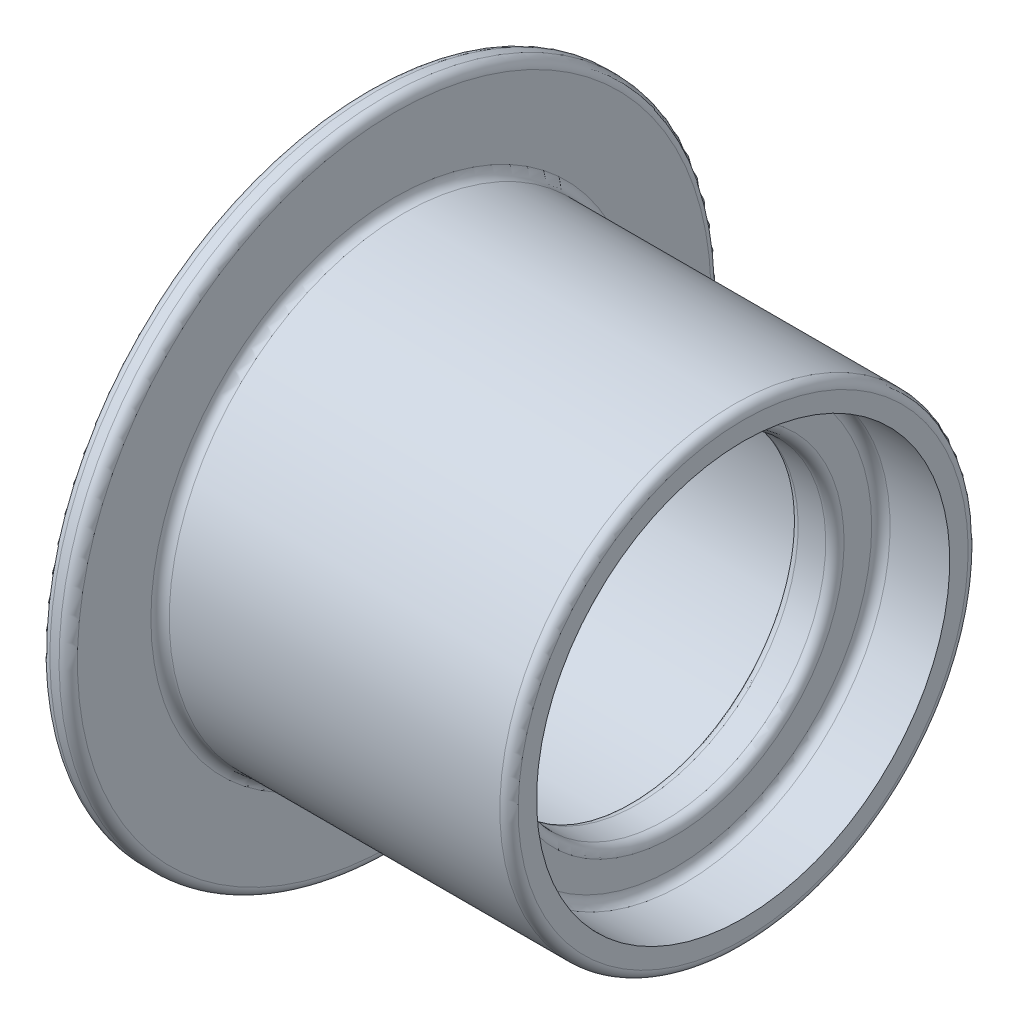
ISO-10303-21;
HEADER;
FILE_DESCRIPTION(('STEP AP214'),'2;1');
FILE_NAME('part.step','',(''),(''),'','','');
FILE_SCHEMA(('AUTOMOTIVE_DESIGN { 1 0 10303 214 1 1 1 1 }'));
ENDSEC;
DATA;
#1=APPLICATION_CONTEXT('core data for automotive mechanical design processes');
#2=APPLICATION_PROTOCOL_DEFINITION('international standard','automotive_design',2000,#1);
#3=PRODUCT_CONTEXT('',#1,'mechanical');
#4=PRODUCT('Part','Part','',(#3));
#5=PRODUCT_RELATED_PRODUCT_CATEGORY('part','',(#4));
#6=PRODUCT_DEFINITION_FORMATION('','',#4);
#7=PRODUCT_DEFINITION_CONTEXT('part definition',#1,'design');
#8=PRODUCT_DEFINITION('design','',#6,#7);
#9=PRODUCT_DEFINITION_SHAPE('','',#8);
#10=(LENGTH_UNIT() NAMED_UNIT(*) SI_UNIT(.MILLI.,.METRE.));
#11=(NAMED_UNIT(*) PLANE_ANGLE_UNIT() SI_UNIT($,.RADIAN.));
#12=(NAMED_UNIT(*) SI_UNIT($,.STERADIAN.) SOLID_ANGLE_UNIT());
#13=UNCERTAINTY_MEASURE_WITH_UNIT(LENGTH_MEASURE(1.E-05),#10,'distance_accuracy_value','');
#14=(GEOMETRIC_REPRESENTATION_CONTEXT(3) GLOBAL_UNCERTAINTY_ASSIGNED_CONTEXT((#13)) GLOBAL_UNIT_ASSIGNED_CONTEXT((#10,
#11,#12)) REPRESENTATION_CONTEXT('',''));
#15=CARTESIAN_POINT('',(0.,0.,0.));
#16=DIRECTION('',(0.,0.,1.));
#17=DIRECTION('',(1.,0.,0.));
#18=AXIS2_PLACEMENT_3D('',#15,#16,#17);
#19=CARTESIAN_POINT('',(-2.,-25.5,0.));
#20=DIRECTION('',(1.,0.,0.));
#21=DIRECTION('',(0.,1.,0.));
#22=AXIS2_PLACEMENT_3D('',#19,#20,#21);
#23=TOROIDAL_SURFACE('',#22,34.5,0.999999999999999);
#24=CARTESIAN_POINT('',(-3.,-25.5,0.));
#25=DIRECTION('',(1.,0.,0.));
#26=DIRECTION('',(0.,1.,0.));
#27=AXIS2_PLACEMENT_3D('',#24,#25,#26);
#28=CIRCLE('',#27,34.5);
#29=CARTESIAN_POINT('',(-3.,8.99999999999999,0.));
#30=VERTEX_POINT('',#29);
#31=EDGE_CURVE('E10',#30,#30,#28,.T.);
#32=ORIENTED_EDGE('',*,*,#31,.T.);
#33=EDGE_LOOP('',(#32));
#34=FACE_BOUND('',#33,.T.);
#35=CARTESIAN_POINT('',(-1.99999999999999,-25.5,0.));
#36=DIRECTION('',(1.,0.,0.));
#37=DIRECTION('',(0.,1.,0.));
#38=AXIS2_PLACEMENT_3D('',#35,#36,#37);
#39=CIRCLE('',#38,35.5);
#40=CARTESIAN_POINT('',(-1.99999999999999,10.,0.));
#41=VERTEX_POINT('',#40);
#42=EDGE_CURVE('E138',#41,#41,#39,.T.);
#43=ORIENTED_EDGE('',*,*,#42,.F.);
#44=EDGE_LOOP('',(#43));
#45=FACE_BOUND('',#44,.T.);
#46=ADVANCED_FACE('F43',(#34,#45),#23,.T.);
#47=CARTESIAN_POINT('',(-3.,8.99999999999999,0.));
#48=DIRECTION('',(-1.,0.,0.));
#49=DIRECTION('',(0.,-1.,0.));
#50=AXIS2_PLACEMENT_3D('',#47,#48,#49);
#51=PLANE('',#50);
#52=CARTESIAN_POINT('',(-3.,-25.5,0.));
#53=DIRECTION('',(1.,0.,0.));
#54=DIRECTION('',(0.,1.,0.));
#55=AXIS2_PLACEMENT_3D('',#52,#53,#54);
#56=CIRCLE('',#55,23.5);
#57=CARTESIAN_POINT('',(-3.,-2.,0.));
#58=VERTEX_POINT('',#57);
#59=EDGE_CURVE('E50',#58,#58,#56,.T.);
#60=ORIENTED_EDGE('',*,*,#59,.T.);
#61=EDGE_LOOP('',(#60));
#62=FACE_BOUND('',#61,.T.);
#63=ORIENTED_EDGE('',*,*,#31,.F.);
#64=EDGE_LOOP('',(#63));
#65=FACE_BOUND('',#64,.T.);
#66=ADVANCED_FACE('F147',(#62,#65),#51,.T.);
#67=CARTESIAN_POINT('',(-2.,-25.5,0.));
#68=DIRECTION('',(1.,0.,0.));
#69=DIRECTION('',(0.,1.,0.));
#70=AXIS2_PLACEMENT_3D('',#67,#68,#69);
#71=TOROIDAL_SURFACE('',#70,23.5,1.);
#72=CARTESIAN_POINT('',(-1.99999999999999,-25.5,0.));
#73=DIRECTION('',(1.,0.,0.));
#74=DIRECTION('',(0.,1.,0.));
#75=AXIS2_PLACEMENT_3D('',#72,#73,#74);
#76=CIRCLE('',#75,22.5);
#77=CARTESIAN_POINT('',(-1.99999999999999,-3.,0.));
#78=VERTEX_POINT('',#77);
#79=EDGE_CURVE('E55',#78,#78,#76,.T.);
#80=ORIENTED_EDGE('',*,*,#79,.T.);
#81=EDGE_LOOP('',(#80));
#82=FACE_BOUND('',#81,.T.);
#83=ORIENTED_EDGE('',*,*,#59,.F.);
#84=EDGE_LOOP('',(#83));
#85=FACE_BOUND('',#84,.T.);
#86=ADVANCED_FACE('F151',(#82,#85),#71,.T.);
#87=CARTESIAN_POINT('',(7.00000000000001,-25.5,0.));
#88=DIRECTION('',(1.,0.,0.));
#89=DIRECTION('',(0.,1.,0.));
#90=AXIS2_PLACEMENT_3D('',#87,#88,#89);
#91=CYLINDRICAL_SURFACE('',#90,22.5);
#92=CARTESIAN_POINT('',(6.,-25.5,0.));
#93=DIRECTION('',(1.,0.,0.));
#94=DIRECTION('',(0.,1.,0.));
#95=AXIS2_PLACEMENT_3D('',#92,#93,#94);
#96=CIRCLE('',#95,22.5);
#97=CARTESIAN_POINT('',(6.,-3.,0.));
#98=VERTEX_POINT('',#97);
#99=EDGE_CURVE('E60',#98,#98,#96,.T.);
#100=ORIENTED_EDGE('',*,*,#99,.T.);
#101=EDGE_LOOP('',(#100));
#102=FACE_BOUND('',#101,.T.);
#103=ORIENTED_EDGE('',*,*,#79,.F.);
#104=EDGE_LOOP('',(#103));
#105=FACE_BOUND('',#104,.T.);
#106=ADVANCED_FACE('F155',(#102,#105),#91,.F.);
#107=CARTESIAN_POINT('',(6.,-25.5,0.));
#108=DIRECTION('',(1.,0.,0.));
#109=DIRECTION('',(0.,1.,0.));
#110=AXIS2_PLACEMENT_3D('',#107,#108,#109);
#111=TOROIDAL_SURFACE('',#110,21.5,1.);
#112=CARTESIAN_POINT('',(7.,-25.5,0.));
#113=DIRECTION('',(1.,0.,0.));
#114=DIRECTION('',(0.,1.,0.));
#115=AXIS2_PLACEMENT_3D('',#112,#113,#114);
#116=CIRCLE('',#115,21.5);
#117=CARTESIAN_POINT('',(7.,-4.,0.));
#118=VERTEX_POINT('',#117);
#119=EDGE_CURVE('E66',#118,#118,#116,.T.);
#120=ORIENTED_EDGE('',*,*,#119,.T.);
#121=EDGE_LOOP('',(#120));
#122=FACE_BOUND('',#121,.T.);
#123=ORIENTED_EDGE('',*,*,#99,.F.);
#124=EDGE_LOOP('',(#123));
#125=FACE_BOUND('',#124,.T.);
#126=ADVANCED_FACE('F162',(#122,#125),#111,.F.);
#127=CARTESIAN_POINT('',(7.,-4.,0.));
#128=DIRECTION('',(-1.,0.,0.));
#129=DIRECTION('',(0.,-1.,0.));
#130=AXIS2_PLACEMENT_3D('',#127,#128,#129);
#131=PLANE('',#130);
#132=CARTESIAN_POINT('',(7.,-25.5,0.));
#133=DIRECTION('',(1.,0.,0.));
#134=DIRECTION('',(0.,1.,0.));
#135=AXIS2_PLACEMENT_3D('',#132,#133,#134);
#136=CIRCLE('',#135,20.9926931818182);
#137=CARTESIAN_POINT('',(7.,-4.50730681818181,0.));
#138=VERTEX_POINT('',#137);
#139=EDGE_CURVE('E70',#138,#138,#136,.T.);
#140=ORIENTED_EDGE('',*,*,#139,.T.);
#141=EDGE_LOOP('',(#140));
#142=FACE_BOUND('',#141,.T.);
#143=ORIENTED_EDGE('',*,*,#119,.F.);
#144=EDGE_LOOP('',(#143));
#145=FACE_BOUND('',#144,.T.);
#146=ADVANCED_FACE('F166',(#142,#145),#131,.T.);
#147=CARTESIAN_POINT('',(8.,-25.5,0.));
#148=DIRECTION('',(1.,0.,0.));
#149=DIRECTION('',(0.,1.,0.));
#150=AXIS2_PLACEMENT_3D('',#147,#148,#149);
#151=TOROIDAL_SURFACE('',#150,20.9926931818182,1.);
#152=CARTESIAN_POINT('',(8.,-25.5,0.));
#153=DIRECTION('',(1.,0.,0.));
#154=DIRECTION('',(0.,1.,0.));
#155=AXIS2_PLACEMENT_3D('',#152,#153,#154);
#156=CIRCLE('',#155,19.9926931818182);
#157=CARTESIAN_POINT('',(8.,-5.50730681818181,0.));
#158=VERTEX_POINT('',#157);
#159=EDGE_CURVE('E74',#158,#158,#156,.T.);
#160=ORIENTED_EDGE('',*,*,#159,.T.);
#161=EDGE_LOOP('',(#160));
#162=FACE_BOUND('',#161,.T.);
#163=ORIENTED_EDGE('',*,*,#139,.F.);
#164=EDGE_LOOP('',(#163));
#165=FACE_BOUND('',#164,.T.);
#166=ADVANCED_FACE('F170',(#162,#165),#151,.T.);
#167=CARTESIAN_POINT('',(7.00000000000001,-25.5,0.));
#168=DIRECTION('',(1.,0.,0.));
#169=DIRECTION('',(0.,1.,0.));
#170=AXIS2_PLACEMENT_3D('',#167,#168,#169);
#171=CYLINDRICAL_SURFACE('',#170,19.9926931818182);
#172=CARTESIAN_POINT('',(24.5,-25.5,0.));
#173=DIRECTION('',(1.,0.,0.));
#174=DIRECTION('',(0.,1.,0.));
#175=AXIS2_PLACEMENT_3D('',#172,#173,#174);
#176=CIRCLE('',#175,19.9926931818182);
#177=CARTESIAN_POINT('',(24.5,-5.5073068181818,0.));
#178=VERTEX_POINT('',#177);
#179=EDGE_CURVE('E78',#178,#178,#176,.T.);
#180=ORIENTED_EDGE('',*,*,#179,.T.);
#181=EDGE_LOOP('',(#180));
#182=FACE_BOUND('',#181,.T.);
#183=ORIENTED_EDGE('',*,*,#159,.F.);
#184=EDGE_LOOP('',(#183));
#185=FACE_BOUND('',#184,.T.);
#186=ADVANCED_FACE('F174',(#182,#185),#171,.F.);
#187=CARTESIAN_POINT('',(24.5,-25.5,0.));
#188=DIRECTION('',(1.,0.,0.));
#189=DIRECTION('',(0.,1.,0.));
#190=AXIS2_PLACEMENT_3D('',#187,#188,#189);
#191=TOROIDAL_SURFACE('',#190,18.9926931818182,1.);
#192=CARTESIAN_POINT('',(25.5,-25.5,0.));
#193=DIRECTION('',(1.,0.,0.));
#194=DIRECTION('',(0.,1.,0.));
#195=AXIS2_PLACEMENT_3D('',#192,#193,#194);
#196=CIRCLE('',#195,18.9926931818182);
#197=CARTESIAN_POINT('',(25.5,-6.5073068181818,0.));
#198=VERTEX_POINT('',#197);
#199=EDGE_CURVE('E82',#198,#198,#196,.T.);
#200=ORIENTED_EDGE('',*,*,#199,.T.);
#201=EDGE_LOOP('',(#200));
#202=FACE_BOUND('',#201,.T.);
#203=ORIENTED_EDGE('',*,*,#179,.F.);
#204=EDGE_LOOP('',(#203));
#205=FACE_BOUND('',#204,.T.);
#206=ADVANCED_FACE('F178',(#202,#205),#191,.F.);
#207=CARTESIAN_POINT('',(25.5,-6.50730681818181,0.));
#208=DIRECTION('',(-1.,0.,0.));
#209=DIRECTION('',(0.,-1.,0.));
#210=AXIS2_PLACEMENT_3D('',#207,#208,#209);
#211=PLANE('',#210);
#212=CARTESIAN_POINT('',(25.5,-25.5,0.));
#213=DIRECTION('',(1.,0.,0.));
#214=DIRECTION('',(0.,1.,0.));
#215=AXIS2_PLACEMENT_3D('',#212,#213,#214);
#216=CIRCLE('',#215,18.4926931818182);
#217=CARTESIAN_POINT('',(25.5,-7.0073068181818,0.));
#218=VERTEX_POINT('',#217);
#219=EDGE_CURVE('E86',#218,#218,#216,.T.);
#220=ORIENTED_EDGE('',*,*,#219,.T.);
#221=EDGE_LOOP('',(#220));
#222=FACE_BOUND('',#221,.T.);
#223=ORIENTED_EDGE('',*,*,#199,.F.);
#224=EDGE_LOOP('',(#223));
#225=FACE_BOUND('',#224,.T.);
#226=ADVANCED_FACE('F182',(#222,#225),#211,.T.);
#227=CARTESIAN_POINT('',(26.5,-25.5,0.));
#228=DIRECTION('',(1.,0.,0.));
#229=DIRECTION('',(0.,1.,0.));
#230=AXIS2_PLACEMENT_3D('',#227,#228,#229);
#231=TOROIDAL_SURFACE('',#230,18.4926931818182,1.);
#232=CARTESIAN_POINT('',(26.5,-25.5,0.));
#233=DIRECTION('',(1.,0.,0.));
#234=DIRECTION('',(0.,1.,0.));
#235=AXIS2_PLACEMENT_3D('',#232,#233,#234);
#236=CIRCLE('',#235,17.4926931818182);
#237=CARTESIAN_POINT('',(26.5,-8.00730681818181,0.));
#238=VERTEX_POINT('',#237);
#239=EDGE_CURVE('E90',#238,#238,#236,.T.);
#240=ORIENTED_EDGE('',*,*,#239,.T.);
#241=EDGE_LOOP('',(#240));
#242=FACE_BOUND('',#241,.T.);
#243=ORIENTED_EDGE('',*,*,#219,.F.);
#244=EDGE_LOOP('',(#243));
#245=FACE_BOUND('',#244,.T.);
#246=ADVANCED_FACE('F186',(#242,#245),#231,.T.);
#247=CARTESIAN_POINT('',(7.00000000000001,-25.5,0.));
#248=DIRECTION('',(1.,0.,0.));
#249=DIRECTION('',(0.,1.,0.));
#250=AXIS2_PLACEMENT_3D('',#247,#248,#249);
#251=CYLINDRICAL_SURFACE('',#250,17.4926931818182);
#252=CARTESIAN_POINT('',(29.5,-25.5,0.));
#253=DIRECTION('',(1.,0.,0.));
#254=DIRECTION('',(0.,1.,0.));
#255=AXIS2_PLACEMENT_3D('',#252,#253,#254);
#256=CIRCLE('',#255,17.4926931818182);
#257=CARTESIAN_POINT('',(29.5,-8.00730681818181,0.));
#258=VERTEX_POINT('',#257);
#259=EDGE_CURVE('E94',#258,#258,#256,.T.);
#260=ORIENTED_EDGE('',*,*,#259,.T.);
#261=EDGE_LOOP('',(#260));
#262=FACE_BOUND('',#261,.T.);
#263=ORIENTED_EDGE('',*,*,#239,.F.);
#264=EDGE_LOOP('',(#263));
#265=FACE_BOUND('',#264,.T.);
#266=ADVANCED_FACE('F190',(#262,#265),#251,.F.);
#267=CARTESIAN_POINT('',(29.5,-25.5,0.));
#268=DIRECTION('',(1.,0.,0.));
#269=DIRECTION('',(0.,1.,0.));
#270=AXIS2_PLACEMENT_3D('',#267,#268,#269);
#271=TOROIDAL_SURFACE('',#270,18.4926931818182,1.);
#272=CARTESIAN_POINT('',(30.5,-25.5,0.));
#273=DIRECTION('',(1.,0.,0.));
#274=DIRECTION('',(0.,1.,0.));
#275=AXIS2_PLACEMENT_3D('',#272,#273,#274);
#276=CIRCLE('',#275,18.4926931818182);
#277=CARTESIAN_POINT('',(30.5,-7.0073068181818,0.));
#278=VERTEX_POINT('',#277);
#279=EDGE_CURVE('E98',#278,#278,#276,.T.);
#280=ORIENTED_EDGE('',*,*,#279,.T.);
#281=EDGE_LOOP('',(#280));
#282=FACE_BOUND('',#281,.T.);
#283=ORIENTED_EDGE('',*,*,#259,.F.);
#284=EDGE_LOOP('',(#283));
#285=FACE_BOUND('',#284,.T.);
#286=ADVANCED_FACE('F194',(#282,#285),#271,.T.);
#287=CARTESIAN_POINT('',(30.5,-7.00730681818181,0.));
#288=DIRECTION('',(1.,0.,0.));
#289=DIRECTION('',(0.,1.,0.));
#290=AXIS2_PLACEMENT_3D('',#287,#288,#289);
#291=PLANE('',#290);
#292=CARTESIAN_POINT('',(30.5,-25.5,0.));
#293=DIRECTION('',(1.,0.,0.));
#294=DIRECTION('',(0.,1.,0.));
#295=AXIS2_PLACEMENT_3D('',#292,#293,#294);
#296=CIRCLE('',#295,21.5);
#297=CARTESIAN_POINT('',(30.5,-4.,0.));
#298=VERTEX_POINT('',#297);
#299=EDGE_CURVE('E102',#298,#298,#296,.T.);
#300=ORIENTED_EDGE('',*,*,#299,.T.);
#301=EDGE_LOOP('',(#300));
#302=FACE_BOUND('',#301,.T.);
#303=ORIENTED_EDGE('',*,*,#279,.F.);
#304=EDGE_LOOP('',(#303));
#305=FACE_BOUND('',#304,.T.);
#306=ADVANCED_FACE('F198',(#302,#305),#291,.T.);
#307=CARTESIAN_POINT('',(31.5,-25.5,0.));
#308=DIRECTION('',(1.,0.,0.));
#309=DIRECTION('',(0.,1.,0.));
#310=AXIS2_PLACEMENT_3D('',#307,#308,#309);
#311=TOROIDAL_SURFACE('',#310,21.5,1.);
#312=CARTESIAN_POINT('',(31.5,-25.5,0.));
#313=DIRECTION('',(1.,0.,0.));
#314=DIRECTION('',(0.,1.,0.));
#315=AXIS2_PLACEMENT_3D('',#312,#313,#314);
#316=CIRCLE('',#315,22.5);
#317=CARTESIAN_POINT('',(31.5,-3.,0.));
#318=VERTEX_POINT('',#317);
#319=EDGE_CURVE('E106',#318,#318,#316,.T.);
#320=ORIENTED_EDGE('',*,*,#319,.T.);
#321=EDGE_LOOP('',(#320));
#322=FACE_BOUND('',#321,.T.);
#323=ORIENTED_EDGE('',*,*,#299,.F.);
#324=EDGE_LOOP('',(#323));
#325=FACE_BOUND('',#324,.T.);
#326=ADVANCED_FACE('F202',(#322,#325),#311,.F.);
#327=CARTESIAN_POINT('',(7.00000000000001,-25.5,0.));
#328=DIRECTION('',(1.,0.,0.));
#329=DIRECTION('',(0.,1.,0.));
#330=AXIS2_PLACEMENT_3D('',#327,#328,#329);
#331=CYLINDRICAL_SURFACE('',#330,22.5);
#332=CARTESIAN_POINT('',(38.,-25.5,0.));
#333=DIRECTION('',(1.,0.,0.));
#334=DIRECTION('',(0.,1.,0.));
#335=AXIS2_PLACEMENT_3D('',#332,#333,#334);
#336=CIRCLE('',#335,22.5);
#337=CARTESIAN_POINT('',(38.,-3.,0.));
#338=VERTEX_POINT('',#337);
#339=EDGE_CURVE('E110',#338,#338,#336,.T.);
#340=ORIENTED_EDGE('',*,*,#339,.T.);
#341=EDGE_LOOP('',(#340));
#342=FACE_BOUND('',#341,.T.);
#343=ORIENTED_EDGE('',*,*,#319,.F.);
#344=EDGE_LOOP('',(#343));
#345=FACE_BOUND('',#344,.T.);
#346=ADVANCED_FACE('F206',(#342,#345),#331,.F.);
#347=CARTESIAN_POINT('',(38.,-3.,0.));
#348=DIRECTION('',(1.,0.,0.));
#349=DIRECTION('',(0.,1.,0.));
#350=AXIS2_PLACEMENT_3D('',#347,#348,#349);
#351=PLANE('',#350);
#352=CARTESIAN_POINT('',(38.,-25.5,0.));
#353=DIRECTION('',(1.,0.,0.));
#354=DIRECTION('',(0.,1.,0.));
#355=AXIS2_PLACEMENT_3D('',#352,#353,#354);
#356=CIRCLE('',#355,24.5);
#357=CARTESIAN_POINT('',(38.,-1.,0.));
#358=VERTEX_POINT('',#357);
#359=EDGE_CURVE('E114',#358,#358,#356,.T.);
#360=ORIENTED_EDGE('',*,*,#359,.T.);
#361=EDGE_LOOP('',(#360));
#362=FACE_BOUND('',#361,.T.);
#363=ORIENTED_EDGE('',*,*,#339,.F.);
#364=EDGE_LOOP('',(#363));
#365=FACE_BOUND('',#364,.T.);
#366=ADVANCED_FACE('F210',(#362,#365),#351,.T.);
#367=CARTESIAN_POINT('',(37.,-25.5,0.));
#368=DIRECTION('',(1.,0.,0.));
#369=DIRECTION('',(0.,1.,0.));
#370=AXIS2_PLACEMENT_3D('',#367,#368,#369);
#371=TOROIDAL_SURFACE('',#370,24.5,1.);
#372=CARTESIAN_POINT('',(37.,-25.5,0.));
#373=DIRECTION('',(1.,0.,0.));
#374=DIRECTION('',(0.,1.,0.));
#375=AXIS2_PLACEMENT_3D('',#372,#373,#374);
#376=CIRCLE('',#375,25.5);
#377=CARTESIAN_POINT('',(37.,0.,0.));
#378=VERTEX_POINT('',#377);
#379=EDGE_CURVE('E118',#378,#378,#376,.T.);
#380=ORIENTED_EDGE('',*,*,#379,.T.);
#381=EDGE_LOOP('',(#380));
#382=FACE_BOUND('',#381,.T.);
#383=ORIENTED_EDGE('',*,*,#359,.F.);
#384=EDGE_LOOP('',(#383));
#385=FACE_BOUND('',#384,.T.);
#386=ADVANCED_FACE('F214',(#382,#385),#371,.T.);
#387=CARTESIAN_POINT('',(7.00000000000001,-25.5,0.));
#388=DIRECTION('',(1.,0.,0.));
#389=DIRECTION('',(0.,1.,0.));
#390=AXIS2_PLACEMENT_3D('',#387,#388,#389);
#391=CYLINDRICAL_SURFACE('',#390,25.5);
#392=CARTESIAN_POINT('',(1.00000000000001,-25.5,0.));
#393=DIRECTION('',(1.,0.,0.));
#394=DIRECTION('',(0.,1.,0.));
#395=AXIS2_PLACEMENT_3D('',#392,#393,#394);
#396=CIRCLE('',#395,25.5);
#397=CARTESIAN_POINT('',(1.00000000000001,0.,0.));
#398=VERTEX_POINT('',#397);
#399=EDGE_CURVE('E122',#398,#398,#396,.T.);
#400=ORIENTED_EDGE('',*,*,#399,.T.);
#401=EDGE_LOOP('',(#400));
#402=FACE_BOUND('',#401,.T.);
#403=ORIENTED_EDGE('',*,*,#379,.F.);
#404=EDGE_LOOP('',(#403));
#405=FACE_BOUND('',#404,.T.);
#406=ADVANCED_FACE('F218',(#402,#405),#391,.T.);
#407=CARTESIAN_POINT('',(1.,-25.5,0.));
#408=DIRECTION('',(1.,0.,0.));
#409=DIRECTION('',(0.,1.,0.));
#410=AXIS2_PLACEMENT_3D('',#407,#408,#409);
#411=TOROIDAL_SURFACE('',#410,26.5,1.);
#412=CARTESIAN_POINT('',(0.,-25.5,0.));
#413=DIRECTION('',(1.,0.,0.));
#414=DIRECTION('',(0.,1.,0.));
#415=AXIS2_PLACEMENT_3D('',#412,#413,#414);
#416=CIRCLE('',#415,26.5);
#417=CARTESIAN_POINT('',(0.,1.00000000000001,0.));
#418=VERTEX_POINT('',#417);
#419=EDGE_CURVE('E126',#418,#418,#416,.T.);
#420=ORIENTED_EDGE('',*,*,#419,.T.);
#421=EDGE_LOOP('',(#420));
#422=FACE_BOUND('',#421,.T.);
#423=ORIENTED_EDGE('',*,*,#399,.F.);
#424=EDGE_LOOP('',(#423));
#425=FACE_BOUND('',#424,.T.);
#426=ADVANCED_FACE('F222',(#422,#425),#411,.F.);
#427=CARTESIAN_POINT('',(0.,1.00000000000001,0.));
#428=DIRECTION('',(1.,0.,0.));
#429=DIRECTION('',(0.,1.,0.));
#430=AXIS2_PLACEMENT_3D('',#427,#428,#429);
#431=PLANE('',#430);
#432=CARTESIAN_POINT('',(0.,-25.5,0.));
#433=DIRECTION('',(1.,0.,0.));
#434=DIRECTION('',(0.,1.,0.));
#435=AXIS2_PLACEMENT_3D('',#432,#433,#434);
#436=CIRCLE('',#435,34.5);
#437=CARTESIAN_POINT('',(0.,8.99999999999999,0.));
#438=VERTEX_POINT('',#437);
#439=EDGE_CURVE('E130',#438,#438,#436,.T.);
#440=ORIENTED_EDGE('',*,*,#439,.T.);
#441=EDGE_LOOP('',(#440));
#442=FACE_BOUND('',#441,.T.);
#443=ORIENTED_EDGE('',*,*,#419,.F.);
#444=EDGE_LOOP('',(#443));
#445=FACE_BOUND('',#444,.T.);
#446=ADVANCED_FACE('F226',(#442,#445),#431,.T.);
#447=CARTESIAN_POINT('',(-0.999999999999995,-25.5,0.));
#448=DIRECTION('',(1.,0.,0.));
#449=DIRECTION('',(0.,1.,0.));
#450=AXIS2_PLACEMENT_3D('',#447,#448,#449);
#451=TOROIDAL_SURFACE('',#450,34.5,1.);
#452=CARTESIAN_POINT('',(-1.,-25.5,0.));
#453=DIRECTION('',(1.,0.,0.));
#454=DIRECTION('',(0.,1.,0.));
#455=AXIS2_PLACEMENT_3D('',#452,#453,#454);
#456=CIRCLE('',#455,35.5);
#457=CARTESIAN_POINT('',(-1.00000000000001,10.,0.));
#458=VERTEX_POINT('',#457);
#459=EDGE_CURVE('E134',#458,#458,#456,.T.);
#460=ORIENTED_EDGE('',*,*,#459,.T.);
#461=EDGE_LOOP('',(#460));
#462=FACE_BOUND('',#461,.T.);
#463=ORIENTED_EDGE('',*,*,#439,.F.);
#464=EDGE_LOOP('',(#463));
#465=FACE_BOUND('',#464,.T.);
#466=ADVANCED_FACE('F230',(#462,#465),#451,.T.);
#467=CARTESIAN_POINT('',(7.00000000000001,-25.5,0.));
#468=DIRECTION('',(1.,0.,0.));
#469=DIRECTION('',(0.,1.,0.));
#470=AXIS2_PLACEMENT_3D('',#467,#468,#469);
#471=CYLINDRICAL_SURFACE('',#470,35.5);
#472=ORIENTED_EDGE('',*,*,#42,.T.);
#473=EDGE_LOOP('',(#472));
#474=FACE_BOUND('',#473,.T.);
#475=ORIENTED_EDGE('',*,*,#459,.F.);
#476=EDGE_LOOP('',(#475));
#477=FACE_BOUND('',#476,.T.);
#478=ADVANCED_FACE('F143',(#474,#477),#471,.T.);
#479=CLOSED_SHELL('',(#46,#66,#86,#106,#126,#146,#166,#186,#206,#226,#246,#266,#286,#306,#326,
#346,#366,#386,#406,#426,#446,#466,#478));
#480=MANIFOLD_SOLID_BREP('B2',#479);
#481=ADVANCED_BREP_SHAPE_REPRESENTATION('',(#18,#480),#14);
#482=SHAPE_DEFINITION_REPRESENTATION(#9,#481);
ENDSEC;
END-ISO-10303-21;
